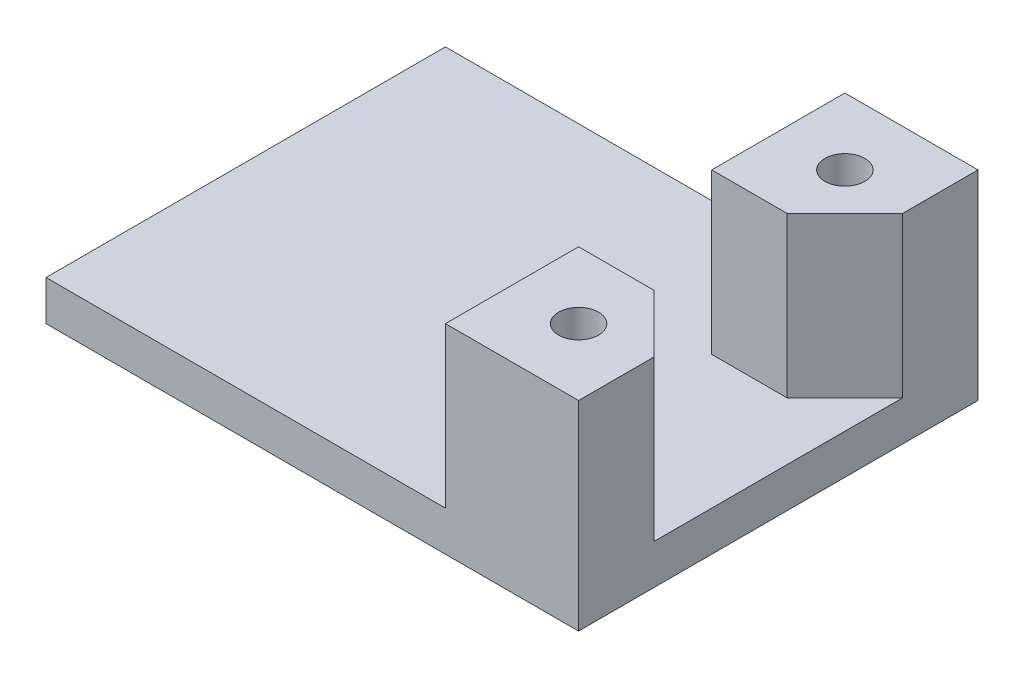
ISO-10303-21;
HEADER;
FILE_DESCRIPTION(('STEP AP214'),'2;1');
FILE_NAME('part.step','',(''),(''),'','','');
FILE_SCHEMA(('AUTOMOTIVE_DESIGN { 1 0 10303 214 1 1 1 1 }'));
ENDSEC;
DATA;
#1=APPLICATION_CONTEXT('core data for automotive mechanical design processes');
#2=APPLICATION_PROTOCOL_DEFINITION('international standard','automotive_design',2000,#1);
#3=PRODUCT_CONTEXT('',#1,'mechanical');
#4=PRODUCT('Part','Part','',(#3));
#5=PRODUCT_RELATED_PRODUCT_CATEGORY('part','',(#4));
#6=PRODUCT_DEFINITION_FORMATION('','',#4);
#7=PRODUCT_DEFINITION_CONTEXT('part definition',#1,'design');
#8=PRODUCT_DEFINITION('design','',#6,#7);
#9=PRODUCT_DEFINITION_SHAPE('','',#8);
#10=(LENGTH_UNIT() NAMED_UNIT(*) SI_UNIT(.MILLI.,.METRE.));
#11=(NAMED_UNIT(*) PLANE_ANGLE_UNIT() SI_UNIT($,.RADIAN.));
#12=(NAMED_UNIT(*) SI_UNIT($,.STERADIAN.) SOLID_ANGLE_UNIT());
#13=UNCERTAINTY_MEASURE_WITH_UNIT(LENGTH_MEASURE(1.E-05),#10,'distance_accuracy_value','');
#14=(GEOMETRIC_REPRESENTATION_CONTEXT(3) GLOBAL_UNCERTAINTY_ASSIGNED_CONTEXT((#13)) GLOBAL_UNIT_ASSIGNED_CONTEXT((#10,
#11,#12)) REPRESENTATION_CONTEXT('',''));
#15=CARTESIAN_POINT('',(0.,0.,0.));
#16=DIRECTION('',(0.,0.,1.));
#17=DIRECTION('',(1.,0.,0.));
#18=AXIS2_PLACEMENT_3D('',#15,#16,#17);
#19=CARTESIAN_POINT('',(0.,15.,0.));
#20=DIRECTION('',(0.,1.,0.));
#21=DIRECTION('',(0.,0.,1.));
#22=AXIS2_PLACEMENT_3D('',#19,#20,#21);
#23=PLANE('',#22);
#24=DIRECTION('',(-0.707106781186548,0.,0.707106781186548));
#25=VECTOR('',#24,1.);
#26=CARTESIAN_POINT('',(-23.899354605467,15.,-21.8225712986201));
#27=LINE('',#26,#25);
#28=CARTESIAN_POINT('',(-19.5562088549594,15.,-26.1657170491277));
#29=VERTEX_POINT('',#28);
#30=CARTESIAN_POINT('',(-23.899354605467,15.,-21.8225712986201));
#31=VERTEX_POINT('',#30);
#32=EDGE_CURVE('E240',#29,#31,#27,.T.);
#33=ORIENTED_EDGE('',*,*,#32,.F.);
#34=DIRECTION('',(0.,0.,-1.));
#35=VECTOR('',#34,1.);
#36=CARTESIAN_POINT('',(-19.5562088549594,15.,-31.8225712986201));
#37=LINE('',#36,#35);
#38=CARTESIAN_POINT('',(-19.5562088549594,15.,-31.8225712986201));
#39=VERTEX_POINT('',#38);
#40=EDGE_CURVE('E193',#29,#39,#37,.T.);
#41=ORIENTED_EDGE('',*,*,#40,.T.);
#42=DIRECTION('',(-1.,0.,0.));
#43=VECTOR('',#42,1.);
#44=CARTESIAN_POINT('',(-59.5562088549594,15.,-31.8225712986201));
#45=LINE('',#44,#43);
#46=CARTESIAN_POINT('',(-29.5562088549594,15.,-31.8225712986201));
#47=VERTEX_POINT('',#46);
#48=EDGE_CURVE('E198',#39,#47,#45,.T.);
#49=ORIENTED_EDGE('',*,*,#48,.T.);
#50=DIRECTION('',(0.,0.,-1.));
#51=VECTOR('',#50,1.);
#52=CARTESIAN_POINT('',(-29.5562088549594,15.,-31.8225712986201));
#53=LINE('',#52,#51);
#54=CARTESIAN_POINT('',(-29.5562088549594,15.,-21.8225712986201));
#55=VERTEX_POINT('',#54);
#56=EDGE_CURVE('E160',#55,#47,#53,.T.);
#57=ORIENTED_EDGE('',*,*,#56,.F.);
#58=DIRECTION('',(-1.,0.,0.));
#59=VECTOR('',#58,1.);
#60=CARTESIAN_POINT('',(-29.5562088549594,15.,-21.8225712986201));
#61=LINE('',#60,#59);
#62=EDGE_CURVE('E145',#31,#55,#61,.T.);
#63=ORIENTED_EDGE('',*,*,#62,.F.);
#64=EDGE_LOOP('',(#33,#41,#49,#57,#63));
#65=FACE_BOUND('',#64,.T.);
#66=CARTESIAN_POINT('',(-24.5562088549594,15.,-26.8225712986201));
#67=DIRECTION('',(0.,1.,0.));
#68=DIRECTION('',(0.,0.,1.));
#69=AXIS2_PLACEMENT_3D('',#66,#67,#68);
#70=CIRCLE('',#69,1.5);
#71=CARTESIAN_POINT('',(-24.5562088549594,15.,-25.3225712986201));
#72=VERTEX_POINT('',#71);
#73=EDGE_CURVE('E185',#72,#72,#70,.T.);
#74=ORIENTED_EDGE('',*,*,#73,.F.);
#75=EDGE_LOOP('',(#74));
#76=FACE_BOUND('',#75,.T.);
#77=ADVANCED_FACE('F35',(#65,#76),#23,.T.);
#78=CARTESIAN_POINT('',(-29.5562088549594,3.,-31.8225712986201));
#79=DIRECTION('',(1.,0.,0.));
#80=DIRECTION('',(0.,0.,-1.));
#81=AXIS2_PLACEMENT_3D('',#78,#79,#80);
#82=PLANE('',#81);
#83=DIRECTION('',(0.,0.,-1.));
#84=VECTOR('',#83,1.);
#85=CARTESIAN_POINT('',(-29.5562088549594,3.,-31.8225712986201));
#86=LINE('',#85,#84);
#87=CARTESIAN_POINT('',(-29.5562088549594,3.,-21.8225712986201));
#88=VERTEX_POINT('',#87);
#89=CARTESIAN_POINT('',(-29.5562088549594,3.,-31.8225712986201));
#90=VERTEX_POINT('',#89);
#91=EDGE_CURVE('E167',#88,#90,#86,.T.);
#92=ORIENTED_EDGE('',*,*,#91,.F.);
#93=DIRECTION('',(0.,1.,0.));
#94=VECTOR('',#93,1.);
#95=CARTESIAN_POINT('',(-29.5562088549594,3.,-21.8225712986201));
#96=LINE('',#95,#94);
#97=EDGE_CURVE('E157',#88,#55,#96,.T.);
#98=ORIENTED_EDGE('',*,*,#97,.T.);
#99=ORIENTED_EDGE('',*,*,#56,.T.);
#100=DIRECTION('',(0.,1.,0.));
#101=VECTOR('',#100,1.);
#102=CARTESIAN_POINT('',(-29.5562088549594,3.,-31.8225712986201));
#103=LINE('',#102,#101);
#104=EDGE_CURVE('E174',#90,#47,#103,.T.);
#105=ORIENTED_EDGE('',*,*,#104,.F.);
#106=EDGE_LOOP('',(#92,#98,#99,#105));
#107=FACE_BOUND('',#106,.T.);
#108=ADVANCED_FACE('F252',(#107),#82,.F.);
#109=CARTESIAN_POINT('',(-59.5562088549594,15.,-31.8225712986201));
#110=DIRECTION('',(1.,0.,0.));
#111=DIRECTION('',(0.,0.,-1.));
#112=AXIS2_PLACEMENT_3D('',#109,#110,#111);
#113=PLANE('',#112);
#114=DIRECTION('',(0.,0.,1.));
#115=VECTOR('',#114,1.);
#116=CARTESIAN_POINT('',(-59.5562088549594,3.,-31.8225712986201));
#117=LINE('',#116,#115);
#118=CARTESIAN_POINT('',(-59.5562088549594,3.,-31.8225712986201));
#119=VERTEX_POINT('',#118);
#120=CARTESIAN_POINT('',(-59.5562088549594,3.,-1.8225712986201));
#121=VERTEX_POINT('',#120);
#122=EDGE_CURVE('E162',#119,#121,#117,.T.);
#123=ORIENTED_EDGE('',*,*,#122,.F.);
#124=DIRECTION('',(0.,-1.,0.));
#125=VECTOR('',#124,1.);
#126=CARTESIAN_POINT('',(-59.5562088549594,15.,-31.8225712986201));
#127=LINE('',#126,#125);
#128=CARTESIAN_POINT('',(-59.5562088549594,0.,-31.8225712986201));
#129=VERTEX_POINT('',#128);
#130=EDGE_CURVE('E201',#119,#129,#127,.T.);
#131=ORIENTED_EDGE('',*,*,#130,.T.);
#132=DIRECTION('',(0.,0.,1.));
#133=VECTOR('',#132,1.);
#134=CARTESIAN_POINT('',(-59.5562088549594,0.,-31.8225712986201));
#135=LINE('',#134,#133);
#136=CARTESIAN_POINT('',(-59.5562088549594,0.,-1.8225712986201));
#137=VERTEX_POINT('',#136);
#138=EDGE_CURVE('E188',#129,#137,#135,.T.);
#139=ORIENTED_EDGE('',*,*,#138,.T.);
#140=DIRECTION('',(0.,-1.,0.));
#141=VECTOR('',#140,1.);
#142=CARTESIAN_POINT('',(-59.5562088549594,15.,-1.8225712986201));
#143=LINE('',#142,#141);
#144=EDGE_CURVE('E11',#121,#137,#143,.T.);
#145=ORIENTED_EDGE('',*,*,#144,.F.);
#146=EDGE_LOOP('',(#123,#131,#139,#145));
#147=FACE_BOUND('',#146,.T.);
#148=ADVANCED_FACE('F37',(#147),#113,.F.);
#149=DIRECTION('',(0.707106781186548,0.,0.707106781186547));
#150=VECTOR('',#149,1.);
#151=CARTESIAN_POINT('',(-23.899354605467,15.,-11.8225712986201));
#152=LINE('',#151,#150);
#153=CARTESIAN_POINT('',(-23.899354605467,15.,-11.8225712986201));
#154=VERTEX_POINT('',#153);
#155=CARTESIAN_POINT('',(-19.5562088549594,15.,-7.47942554811248));
#156=VERTEX_POINT('',#155);
#157=EDGE_CURVE('E130',#154,#156,#152,.T.);
#158=ORIENTED_EDGE('',*,*,#157,.F.);
#159=DIRECTION('',(1.,0.,0.));
#160=VECTOR('',#159,1.);
#161=CARTESIAN_POINT('',(-29.5562088549594,15.,-11.8225712986201));
#162=LINE('',#161,#160);
#163=CARTESIAN_POINT('',(-29.5562088549594,15.,-11.8225712986201));
#164=VERTEX_POINT('',#163);
#165=EDGE_CURVE('E138',#164,#154,#162,.T.);
#166=ORIENTED_EDGE('',*,*,#165,.F.);
#167=CARTESIAN_POINT('',(-29.5562088549594,15.,-1.8225712986201));
#168=VERTEX_POINT('',#167);
#169=EDGE_CURVE('E165',#168,#164,#53,.T.);
#170=ORIENTED_EDGE('',*,*,#169,.F.);
#171=DIRECTION('',(1.,0.,0.));
#172=VECTOR('',#171,1.);
#173=CARTESIAN_POINT('',(-59.5562088549594,15.,-1.8225712986201));
#174=LINE('',#173,#172);
#175=CARTESIAN_POINT('',(-19.5562088549594,15.,-1.8225712986201));
#176=VERTEX_POINT('',#175);
#177=EDGE_CURVE('E191',#168,#176,#174,.T.);
#178=ORIENTED_EDGE('',*,*,#177,.T.);
#179=EDGE_CURVE('E195',#176,#156,#37,.T.);
#180=ORIENTED_EDGE('',*,*,#179,.T.);
#181=EDGE_LOOP('',(#158,#166,#170,#178,#180));
#182=FACE_BOUND('',#181,.T.);
#183=CARTESIAN_POINT('',(-24.5562088549594,15.,-6.8225712986201));
#184=DIRECTION('',(0.,1.,0.));
#185=DIRECTION('',(0.,0.,1.));
#186=AXIS2_PLACEMENT_3D('',#183,#184,#185);
#187=CIRCLE('',#186,1.5);
#188=CARTESIAN_POINT('',(-24.5562088549594,15.,-5.3225712986201));
#189=VERTEX_POINT('',#188);
#190=EDGE_CURVE('E179',#189,#189,#187,.T.);
#191=ORIENTED_EDGE('',*,*,#190,.F.);
#192=EDGE_LOOP('',(#191));
#193=FACE_BOUND('',#192,.T.);
#194=ADVANCED_FACE('F263',(#182,#193),#23,.T.);
#195=CARTESIAN_POINT('',(0.,0.,0.));
#196=DIRECTION('',(0.,1.,0.));
#197=DIRECTION('',(0.,0.,1.));
#198=AXIS2_PLACEMENT_3D('',#195,#196,#197);
#199=PLANE('',#198);
#200=CARTESIAN_POINT('',(-24.5562088549594,0.,-26.8225712986201));
#201=DIRECTION('',(0.,1.,0.));
#202=DIRECTION('',(0.,0.,1.));
#203=AXIS2_PLACEMENT_3D('',#200,#201,#202);
#204=CIRCLE('',#203,1.5);
#205=CARTESIAN_POINT('',(-24.5562088549594,0.,-25.3225712986201));
#206=VERTEX_POINT('',#205);
#207=EDGE_CURVE('E182',#206,#206,#204,.T.);
#208=ORIENTED_EDGE('',*,*,#207,.T.);
#209=EDGE_LOOP('',(#208));
#210=FACE_BOUND('',#209,.T.);
#211=ORIENTED_EDGE('',*,*,#138,.F.);
#212=DIRECTION('',(-1.,0.,0.));
#213=VECTOR('',#212,1.);
#214=CARTESIAN_POINT('',(-59.5562088549594,0.,-31.8225712986201));
#215=LINE('',#214,#213);
#216=CARTESIAN_POINT('',(-19.5562088549594,0.,-31.8225712986201));
#217=VERTEX_POINT('',#216);
#218=EDGE_CURVE('E194',#217,#129,#215,.T.);
#219=ORIENTED_EDGE('',*,*,#218,.F.);
#220=DIRECTION('',(0.,0.,-1.));
#221=VECTOR('',#220,1.);
#222=CARTESIAN_POINT('',(-19.5562088549594,0.,-31.8225712986201));
#223=LINE('',#222,#221);
#224=CARTESIAN_POINT('',(-19.5562088549594,0.,-1.8225712986201));
#225=VERTEX_POINT('',#224);
#226=EDGE_CURVE('E206',#225,#217,#223,.T.);
#227=ORIENTED_EDGE('',*,*,#226,.F.);
#228=DIRECTION('',(1.,0.,0.));
#229=VECTOR('',#228,1.);
#230=CARTESIAN_POINT('',(-59.5562088549594,0.,-1.8225712986201));
#231=LINE('',#230,#229);
#232=EDGE_CURVE('E204',#137,#225,#231,.T.);
#233=ORIENTED_EDGE('',*,*,#232,.F.);
#234=EDGE_LOOP('',(#211,#219,#227,#233));
#235=FACE_BOUND('',#234,.T.);
#236=CARTESIAN_POINT('',(-24.5562088549594,0.,-6.8225712986201));
#237=DIRECTION('',(0.,1.,0.));
#238=DIRECTION('',(0.,0.,1.));
#239=AXIS2_PLACEMENT_3D('',#236,#237,#238);
#240=CIRCLE('',#239,1.5);
#241=CARTESIAN_POINT('',(-24.5562088549594,0.,-5.3225712986201));
#242=VERTEX_POINT('',#241);
#243=EDGE_CURVE('E177',#242,#242,#240,.T.);
#244=ORIENTED_EDGE('',*,*,#243,.T.);
#245=EDGE_LOOP('',(#244));
#246=FACE_BOUND('',#245,.T.);
#247=ADVANCED_FACE('F226',(#210,#235,#246),#199,.F.);
#248=CARTESIAN_POINT('',(-59.5562088549594,15.,-1.8225712986201));
#249=DIRECTION('',(0.,0.,-1.));
#250=DIRECTION('',(-1.,0.,0.));
#251=AXIS2_PLACEMENT_3D('',#248,#249,#250);
#252=PLANE('',#251);
#253=ORIENTED_EDGE('',*,*,#177,.F.);
#254=DIRECTION('',(0.,1.,0.));
#255=VECTOR('',#254,1.);
#256=CARTESIAN_POINT('',(-29.5562088549594,3.,-1.8225712986201));
#257=LINE('',#256,#255);
#258=CARTESIAN_POINT('',(-29.5562088549594,3.,-1.8225712986201));
#259=VERTEX_POINT('',#258);
#260=EDGE_CURVE('E171',#259,#168,#257,.T.);
#261=ORIENTED_EDGE('',*,*,#260,.F.);
#262=DIRECTION('',(1.,0.,0.));
#263=VECTOR('',#262,1.);
#264=CARTESIAN_POINT('',(-59.5562088549594,3.,-1.8225712986201));
#265=LINE('',#264,#263);
#266=EDGE_CURVE('E164',#121,#259,#265,.T.);
#267=ORIENTED_EDGE('',*,*,#266,.F.);
#268=ORIENTED_EDGE('',*,*,#144,.T.);
#269=ORIENTED_EDGE('',*,*,#232,.T.);
#270=DIRECTION('',(0.,-1.,0.));
#271=VECTOR('',#270,1.);
#272=CARTESIAN_POINT('',(-19.5562088549594,15.,-1.8225712986201));
#273=LINE('',#272,#271);
#274=EDGE_CURVE('E43',#176,#225,#273,.T.);
#275=ORIENTED_EDGE('',*,*,#274,.F.);
#276=EDGE_LOOP('',(#253,#261,#267,#268,#269,#275));
#277=FACE_BOUND('',#276,.T.);
#278=ADVANCED_FACE('F257',(#277),#252,.F.);
#279=CARTESIAN_POINT('',(-19.5562088549594,15.,-31.8225712986201));
#280=DIRECTION('',(-1.,0.,0.));
#281=DIRECTION('',(0.,0.,1.));
#282=AXIS2_PLACEMENT_3D('',#279,#280,#281);
#283=PLANE('',#282);
#284=DIRECTION('',(0.,0.,-1.));
#285=VECTOR('',#284,1.);
#286=CARTESIAN_POINT('',(-19.5562088549594,3.,-21.8225712986201));
#287=LINE('',#286,#285);
#288=CARTESIAN_POINT('',(-19.5562088549594,3.,-7.47942554811248));
#289=VERTEX_POINT('',#288);
#290=CARTESIAN_POINT('',(-19.5562088549594,3.,-26.1657170491277));
#291=VERTEX_POINT('',#290);
#292=EDGE_CURVE('E144',#289,#291,#287,.T.);
#293=ORIENTED_EDGE('',*,*,#292,.F.);
#294=DIRECTION('',(0.,1.,0.));
#295=VECTOR('',#294,1.);
#296=CARTESIAN_POINT('',(-19.5562088549594,3.,-7.47942554811248));
#297=LINE('',#296,#295);
#298=EDGE_CURVE('E128',#289,#156,#297,.T.);
#299=ORIENTED_EDGE('',*,*,#298,.T.);
#300=ORIENTED_EDGE('',*,*,#179,.F.);
#301=ORIENTED_EDGE('',*,*,#274,.T.);
#302=ORIENTED_EDGE('',*,*,#226,.T.);
#303=DIRECTION('',(0.,-1.,0.));
#304=VECTOR('',#303,1.);
#305=CARTESIAN_POINT('',(-19.5562088549594,15.,-31.8225712986201));
#306=LINE('',#305,#304);
#307=EDGE_CURVE('E211',#39,#217,#306,.T.);
#308=ORIENTED_EDGE('',*,*,#307,.F.);
#309=ORIENTED_EDGE('',*,*,#40,.F.);
#310=DIRECTION('',(0.,1.,0.));
#311=VECTOR('',#310,1.);
#312=CARTESIAN_POINT('',(-19.5562088549594,3.,-26.1657170491277));
#313=LINE('',#312,#311);
#314=EDGE_CURVE('E150',#291,#29,#313,.T.);
#315=ORIENTED_EDGE('',*,*,#314,.F.);
#316=EDGE_LOOP('',(#293,#299,#300,#301,#302,#308,#309,#315));
#317=FACE_BOUND('',#316,.T.);
#318=ADVANCED_FACE('F218',(#317),#283,.F.);
#319=CARTESIAN_POINT('',(-59.5562088549594,15.,-31.8225712986201));
#320=DIRECTION('',(0.,0.,1.));
#321=DIRECTION('',(1.,0.,0.));
#322=AXIS2_PLACEMENT_3D('',#319,#320,#321);
#323=PLANE('',#322);
#324=DIRECTION('',(-1.,0.,0.));
#325=VECTOR('',#324,1.);
#326=CARTESIAN_POINT('',(-59.5562088549594,3.,-31.8225712986201));
#327=LINE('',#326,#325);
#328=EDGE_CURVE('E169',#90,#119,#327,.T.);
#329=ORIENTED_EDGE('',*,*,#328,.F.);
#330=ORIENTED_EDGE('',*,*,#104,.T.);
#331=ORIENTED_EDGE('',*,*,#48,.F.);
#332=ORIENTED_EDGE('',*,*,#307,.T.);
#333=ORIENTED_EDGE('',*,*,#218,.T.);
#334=ORIENTED_EDGE('',*,*,#130,.F.);
#335=EDGE_LOOP('',(#329,#330,#331,#332,#333,#334));
#336=FACE_BOUND('',#335,.T.);
#337=ADVANCED_FACE('F231',(#336),#323,.F.);
#338=CARTESIAN_POINT('',(-24.5562088549594,15.,-26.8225712986201));
#339=DIRECTION('',(0.,-1.,0.));
#340=DIRECTION('',(0.,0.,-1.));
#341=AXIS2_PLACEMENT_3D('',#338,#339,#340);
#342=CYLINDRICAL_SURFACE('',#341,1.5);
#343=ORIENTED_EDGE('',*,*,#73,.T.);
#344=EDGE_LOOP('',(#343));
#345=FACE_BOUND('',#344,.T.);
#346=ORIENTED_EDGE('',*,*,#207,.F.);
#347=EDGE_LOOP('',(#346));
#348=FACE_BOUND('',#347,.T.);
#349=ADVANCED_FACE('F273',(#345,#348),#342,.F.);
#350=CARTESIAN_POINT('',(-24.5562088549594,15.,-6.8225712986201));
#351=DIRECTION('',(0.,-1.,0.));
#352=DIRECTION('',(0.,0.,-1.));
#353=AXIS2_PLACEMENT_3D('',#350,#351,#352);
#354=CYLINDRICAL_SURFACE('',#353,1.5);
#355=ORIENTED_EDGE('',*,*,#190,.T.);
#356=EDGE_LOOP('',(#355));
#357=FACE_BOUND('',#356,.T.);
#358=ORIENTED_EDGE('',*,*,#243,.F.);
#359=EDGE_LOOP('',(#358));
#360=FACE_BOUND('',#359,.T.);
#361=ADVANCED_FACE('F270',(#357,#360),#354,.F.);
#362=ORIENTED_EDGE('',*,*,#169,.T.);
#363=DIRECTION('',(0.,1.,0.));
#364=VECTOR('',#363,1.);
#365=CARTESIAN_POINT('',(-29.5562088549594,3.,-11.8225712986201));
#366=LINE('',#365,#364);
#367=CARTESIAN_POINT('',(-29.5562088549594,3.,-11.8225712986201));
#368=VERTEX_POINT('',#367);
#369=EDGE_CURVE('E154',#368,#164,#366,.T.);
#370=ORIENTED_EDGE('',*,*,#369,.F.);
#371=EDGE_CURVE('E143',#259,#368,#86,.T.);
#372=ORIENTED_EDGE('',*,*,#371,.F.);
#373=ORIENTED_EDGE('',*,*,#260,.T.);
#374=EDGE_LOOP('',(#362,#370,#372,#373));
#375=FACE_BOUND('',#374,.T.);
#376=ADVANCED_FACE('F261',(#375),#82,.F.);
#377=CARTESIAN_POINT('',(0.,3.,0.));
#378=DIRECTION('',(0.,1.,0.));
#379=DIRECTION('',(0.,0.,1.));
#380=AXIS2_PLACEMENT_3D('',#377,#378,#379);
#381=PLANE('',#380);
#382=ORIENTED_EDGE('',*,*,#122,.T.);
#383=ORIENTED_EDGE('',*,*,#266,.T.);
#384=ORIENTED_EDGE('',*,*,#371,.T.);
#385=DIRECTION('',(1.,0.,0.));
#386=VECTOR('',#385,1.);
#387=CARTESIAN_POINT('',(-29.5562088549594,3.,-11.8225712986201));
#388=LINE('',#387,#386);
#389=CARTESIAN_POINT('',(-23.899354605467,3.,-11.8225712986201));
#390=VERTEX_POINT('',#389);
#391=EDGE_CURVE('E135',#368,#390,#388,.T.);
#392=ORIENTED_EDGE('',*,*,#391,.T.);
#393=DIRECTION('',(0.707106781186548,0.,0.707106781186547));
#394=VECTOR('',#393,1.);
#395=CARTESIAN_POINT('',(-23.899354605467,3.,-11.8225712986201));
#396=LINE('',#395,#394);
#397=EDGE_CURVE('E122',#390,#289,#396,.T.);
#398=ORIENTED_EDGE('',*,*,#397,.T.);
#399=ORIENTED_EDGE('',*,*,#292,.T.);
#400=DIRECTION('',(-0.707106781186548,0.,0.707106781186548));
#401=VECTOR('',#400,1.);
#402=CARTESIAN_POINT('',(-23.899354605467,3.,-21.8225712986201));
#403=LINE('',#402,#401);
#404=CARTESIAN_POINT('',(-23.899354605467,3.,-21.8225712986201));
#405=VERTEX_POINT('',#404);
#406=EDGE_CURVE('E50',#291,#405,#403,.T.);
#407=ORIENTED_EDGE('',*,*,#406,.T.);
#408=DIRECTION('',(-1.,0.,0.));
#409=VECTOR('',#408,1.);
#410=CARTESIAN_POINT('',(-29.5562088549594,3.,-21.8225712986201));
#411=LINE('',#410,#409);
#412=EDGE_CURVE('E55',#405,#88,#411,.T.);
#413=ORIENTED_EDGE('',*,*,#412,.T.);
#414=ORIENTED_EDGE('',*,*,#91,.T.);
#415=ORIENTED_EDGE('',*,*,#328,.T.);
#416=EDGE_LOOP('',(#382,#383,#384,#392,#398,#399,#407,#413,#414,#415));
#417=FACE_BOUND('',#416,.T.);
#418=ADVANCED_FACE('F141',(#417),#381,.T.);
#419=CARTESIAN_POINT('',(-29.5562088549594,3.,-21.8225712986201));
#420=DIRECTION('',(0.,0.,-1.));
#421=DIRECTION('',(-1.,0.,0.));
#422=AXIS2_PLACEMENT_3D('',#419,#420,#421);
#423=PLANE('',#422);
#424=ORIENTED_EDGE('',*,*,#412,.F.);
#425=DIRECTION('',(0.,1.,0.));
#426=VECTOR('',#425,1.);
#427=CARTESIAN_POINT('',(-23.899354605467,3.,-21.8225712986201));
#428=LINE('',#427,#426);
#429=EDGE_CURVE('E155',#405,#31,#428,.T.);
#430=ORIENTED_EDGE('',*,*,#429,.T.);
#431=ORIENTED_EDGE('',*,*,#62,.T.);
#432=ORIENTED_EDGE('',*,*,#97,.F.);
#433=EDGE_LOOP('',(#424,#430,#431,#432));
#434=FACE_BOUND('',#433,.T.);
#435=ADVANCED_FACE('F248',(#434),#423,.F.);
#436=CARTESIAN_POINT('',(-29.5562088549594,3.,-11.8225712986201));
#437=DIRECTION('',(0.,0.,1.));
#438=DIRECTION('',(1.,0.,0.));
#439=AXIS2_PLACEMENT_3D('',#436,#437,#438);
#440=PLANE('',#439);
#441=ORIENTED_EDGE('',*,*,#165,.T.);
#442=DIRECTION('',(0.,1.,0.));
#443=VECTOR('',#442,1.);
#444=CARTESIAN_POINT('',(-23.899354605467,3.,-11.8225712986201));
#445=LINE('',#444,#443);
#446=EDGE_CURVE('E125',#390,#154,#445,.T.);
#447=ORIENTED_EDGE('',*,*,#446,.F.);
#448=ORIENTED_EDGE('',*,*,#391,.F.);
#449=ORIENTED_EDGE('',*,*,#369,.T.);
#450=EDGE_LOOP('',(#441,#447,#448,#449));
#451=FACE_BOUND('',#450,.T.);
#452=ADVANCED_FACE('F134',(#451),#440,.F.);
#453=CARTESIAN_POINT('',(-23.899354605467,3.,-21.8225712986201));
#454=DIRECTION('',(-0.707106781186547,0.,-0.707106781186547));
#455=DIRECTION('',(-0.707106781186548,0.,0.707106781186548));
#456=AXIS2_PLACEMENT_3D('',#453,#454,#455);
#457=PLANE('',#456);
#458=ORIENTED_EDGE('',*,*,#32,.T.);
#459=ORIENTED_EDGE('',*,*,#429,.F.);
#460=ORIENTED_EDGE('',*,*,#406,.F.);
#461=ORIENTED_EDGE('',*,*,#314,.T.);
#462=EDGE_LOOP('',(#458,#459,#460,#461));
#463=FACE_BOUND('',#462,.T.);
#464=ADVANCED_FACE('F247',(#463),#457,.F.);
#465=CARTESIAN_POINT('',(-23.899354605467,3.,-11.8225712986201));
#466=DIRECTION('',(-0.707106781186547,0.,0.707106781186548));
#467=DIRECTION('',(0.707106781186548,0.,0.707106781186547));
#468=AXIS2_PLACEMENT_3D('',#465,#466,#467);
#469=PLANE('',#468);
#470=ORIENTED_EDGE('',*,*,#157,.T.);
#471=ORIENTED_EDGE('',*,*,#298,.F.);
#472=ORIENTED_EDGE('',*,*,#397,.F.);
#473=ORIENTED_EDGE('',*,*,#446,.T.);
#474=EDGE_LOOP('',(#470,#471,#472,#473));
#475=FACE_BOUND('',#474,.T.);
#476=ADVANCED_FACE('F124',(#475),#469,.F.);
#477=CLOSED_SHELL('',(#77,#108,#148,#194,#247,#278,#318,#337,#349,#361,#376,#418,#435,#452,#464,#476));
#478=MANIFOLD_SOLID_BREP('B2',#477);
#479=ADVANCED_BREP_SHAPE_REPRESENTATION('',(#18,#478),#14);
#480=SHAPE_DEFINITION_REPRESENTATION(#9,#479);
ENDSEC;
END-ISO-10303-21;
